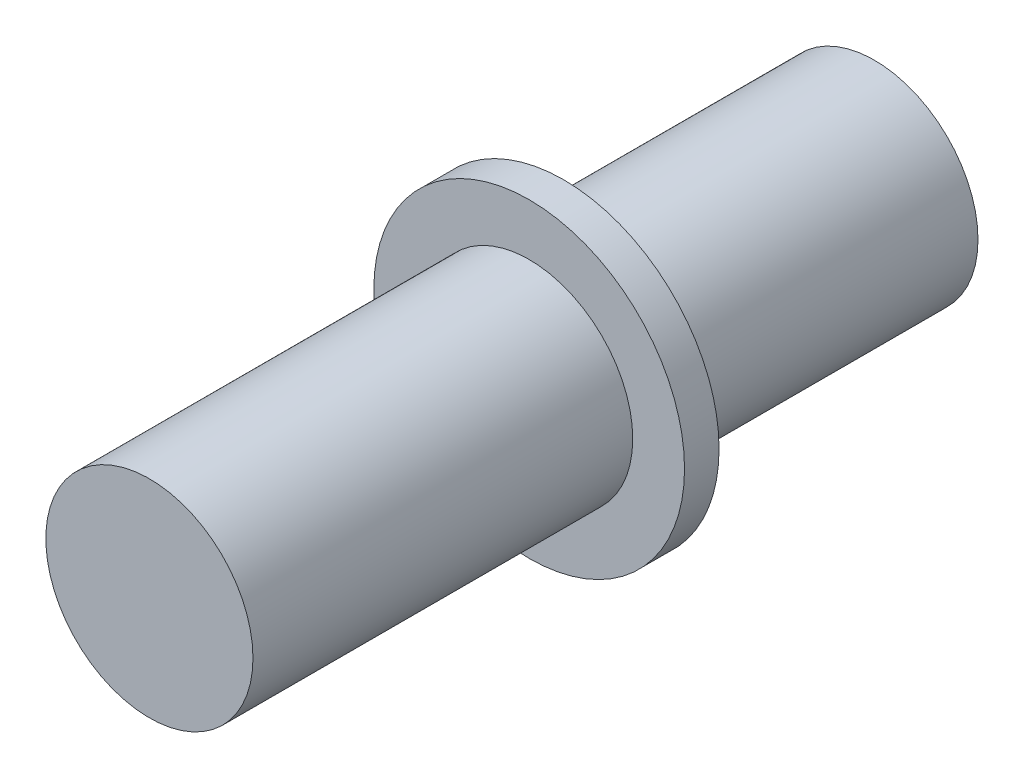
ISO-10303-21;
HEADER;
FILE_DESCRIPTION(('STEP AP214'),'2;1');
FILE_NAME('part.step','',(''),(''),'','','');
FILE_SCHEMA(('AUTOMOTIVE_DESIGN { 1 0 10303 214 1 1 1 1 }'));
ENDSEC;
DATA;
#1=APPLICATION_CONTEXT('core data for automotive mechanical design processes');
#2=APPLICATION_PROTOCOL_DEFINITION('international standard','automotive_design',2000,#1);
#3=PRODUCT_CONTEXT('',#1,'mechanical');
#4=PRODUCT('Part','Part','',(#3));
#5=PRODUCT_RELATED_PRODUCT_CATEGORY('part','',(#4));
#6=PRODUCT_DEFINITION_FORMATION('','',#4);
#7=PRODUCT_DEFINITION_CONTEXT('part definition',#1,'design');
#8=PRODUCT_DEFINITION('design','',#6,#7);
#9=PRODUCT_DEFINITION_SHAPE('','',#8);
#10=(LENGTH_UNIT() NAMED_UNIT(*) SI_UNIT(.MILLI.,.METRE.));
#11=(NAMED_UNIT(*) PLANE_ANGLE_UNIT() SI_UNIT($,.RADIAN.));
#12=(NAMED_UNIT(*) SI_UNIT($,.STERADIAN.) SOLID_ANGLE_UNIT());
#13=UNCERTAINTY_MEASURE_WITH_UNIT(LENGTH_MEASURE(1.E-05),#10,'distance_accuracy_value','');
#14=(GEOMETRIC_REPRESENTATION_CONTEXT(3) GLOBAL_UNCERTAINTY_ASSIGNED_CONTEXT((#13)) GLOBAL_UNIT_ASSIGNED_CONTEXT((#10,
#11,#12)) REPRESENTATION_CONTEXT('',''));
#15=CARTESIAN_POINT('',(0.,0.,0.));
#16=DIRECTION('',(0.,0.,1.));
#17=DIRECTION('',(1.,0.,0.));
#18=AXIS2_PLACEMENT_3D('',#15,#16,#17);
#19=CARTESIAN_POINT('',(0.,0.,42.));
#20=DIRECTION('',(0.,0.,-1.));
#21=DIRECTION('',(-1.,0.,0.));
#22=AXIS2_PLACEMENT_3D('',#19,#20,#21);
#23=CYLINDRICAL_SURFACE('',#22,6.);
#24=CARTESIAN_POINT('',(0.,0.,20.));
#25=DIRECTION('',(0.,0.,1.));
#26=DIRECTION('',(1.,0.,0.));
#27=AXIS2_PLACEMENT_3D('',#24,#25,#26);
#28=CIRCLE('',#27,6.);
#29=CARTESIAN_POINT('',(6.,0.,20.));
#30=VERTEX_POINT('',#29);
#31=EDGE_CURVE('E46',#30,#30,#28,.T.);
#32=ORIENTED_EDGE('',*,*,#31,.T.);
#33=EDGE_LOOP('',(#32));
#34=FACE_BOUND('',#33,.T.);
#35=CARTESIAN_POINT('',(0.,0.,42.));
#36=DIRECTION('',(0.,0.,1.));
#37=DIRECTION('',(1.,0.,0.));
#38=AXIS2_PLACEMENT_3D('',#35,#36,#37);
#39=CIRCLE('',#38,6.);
#40=CARTESIAN_POINT('',(6.,0.,42.));
#41=VERTEX_POINT('',#40);
#42=EDGE_CURVE('E51',#41,#41,#39,.T.);
#43=ORIENTED_EDGE('',*,*,#42,.F.);
#44=EDGE_LOOP('',(#43));
#45=FACE_BOUND('',#44,.T.);
#46=ADVANCED_FACE('F43',(#34,#45),#23,.T.);
#47=CARTESIAN_POINT('',(0.,0.,42.));
#48=DIRECTION('',(0.,0.,1.));
#49=DIRECTION('',(1.,0.,0.));
#50=AXIS2_PLACEMENT_3D('',#47,#48,#49);
#51=PLANE('',#50);
#52=ORIENTED_EDGE('',*,*,#42,.T.);
#53=EDGE_LOOP('',(#52));
#54=FACE_BOUND('',#53,.T.);
#55=ADVANCED_FACE('F88',(#54),#51,.T.);
#56=CARTESIAN_POINT('',(0.,0.,20.));
#57=DIRECTION('',(0.,0.,-1.));
#58=DIRECTION('',(-1.,0.,0.));
#59=AXIS2_PLACEMENT_3D('',#56,#57,#58);
#60=CYLINDRICAL_SURFACE('',#59,9.);
#61=CARTESIAN_POINT('',(0.,0.,20.));
#62=DIRECTION('',(0.,0.,1.));
#63=DIRECTION('',(1.,0.,0.));
#64=AXIS2_PLACEMENT_3D('',#61,#62,#63);
#65=CIRCLE('',#64,9.);
#66=CARTESIAN_POINT('',(9.,0.,20.));
#67=VERTEX_POINT('',#66);
#68=EDGE_CURVE('E66',#67,#67,#65,.T.);
#69=ORIENTED_EDGE('',*,*,#68,.F.);
#70=EDGE_LOOP('',(#69));
#71=FACE_BOUND('',#70,.T.);
#72=CARTESIAN_POINT('',(0.,0.,18.));
#73=DIRECTION('',(0.,0.,1.));
#74=DIRECTION('',(1.,0.,0.));
#75=AXIS2_PLACEMENT_3D('',#72,#73,#74);
#76=CIRCLE('',#75,9.);
#77=CARTESIAN_POINT('',(9.,0.,18.));
#78=VERTEX_POINT('',#77);
#79=EDGE_CURVE('E62',#78,#78,#76,.T.);
#80=ORIENTED_EDGE('',*,*,#79,.T.);
#81=EDGE_LOOP('',(#80));
#82=FACE_BOUND('',#81,.T.);
#83=ADVANCED_FACE('F80',(#71,#82),#60,.T.);
#84=CARTESIAN_POINT('',(0.,0.,20.));
#85=DIRECTION('',(0.,0.,1.));
#86=DIRECTION('',(1.,0.,0.));
#87=AXIS2_PLACEMENT_3D('',#84,#85,#86);
#88=PLANE('',#87);
#89=ORIENTED_EDGE('',*,*,#31,.F.);
#90=EDGE_LOOP('',(#89));
#91=FACE_BOUND('',#90,.T.);
#92=ORIENTED_EDGE('',*,*,#68,.T.);
#93=EDGE_LOOP('',(#92));
#94=FACE_BOUND('',#93,.T.);
#95=ADVANCED_FACE('F77',(#91,#94),#88,.T.);
#96=CARTESIAN_POINT('',(0.,0.,18.));
#97=DIRECTION('',(0.,0.,1.));
#98=DIRECTION('',(1.,0.,0.));
#99=AXIS2_PLACEMENT_3D('',#96,#97,#98);
#100=PLANE('',#99);
#101=CARTESIAN_POINT('',(0.,0.,18.));
#102=DIRECTION('',(0.,0.,1.));
#103=DIRECTION('',(1.,0.,0.));
#104=AXIS2_PLACEMENT_3D('',#101,#102,#103);
#105=CIRCLE('',#104,6.);
#106=CARTESIAN_POINT('',(6.,0.,18.));
#107=VERTEX_POINT('',#106);
#108=EDGE_CURVE('E10',#107,#107,#105,.T.);
#109=ORIENTED_EDGE('',*,*,#108,.T.);
#110=EDGE_LOOP('',(#109));
#111=FACE_BOUND('',#110,.T.);
#112=ORIENTED_EDGE('',*,*,#79,.F.);
#113=EDGE_LOOP('',(#112));
#114=FACE_BOUND('',#113,.T.);
#115=ADVANCED_FACE('F79',(#111,#114),#100,.F.);
#116=CARTESIAN_POINT('',(0.,0.,0.));
#117=DIRECTION('',(0.,0.,1.));
#118=DIRECTION('',(1.,0.,0.));
#119=AXIS2_PLACEMENT_3D('',#116,#117,#118);
#120=PLANE('',#119);
#121=CARTESIAN_POINT('',(0.,0.,0.));
#122=DIRECTION('',(0.,0.,1.));
#123=DIRECTION('',(1.,0.,0.));
#124=AXIS2_PLACEMENT_3D('',#121,#122,#123);
#125=CIRCLE('',#124,6.);
#126=CARTESIAN_POINT('',(6.,0.,0.));
#127=VERTEX_POINT('',#126);
#128=EDGE_CURVE('E56',#127,#127,#125,.T.);
#129=ORIENTED_EDGE('',*,*,#128,.F.);
#130=EDGE_LOOP('',(#129));
#131=FACE_BOUND('',#130,.T.);
#132=ADVANCED_FACE('F86',(#131),#120,.F.);
#133=ORIENTED_EDGE('',*,*,#128,.T.);
#134=EDGE_LOOP('',(#133));
#135=FACE_BOUND('',#134,.T.);
#136=ORIENTED_EDGE('',*,*,#108,.F.);
#137=EDGE_LOOP('',(#136));
#138=FACE_BOUND('',#137,.T.);
#139=ADVANCED_FACE('F92',(#135,#138),#23,.T.);
#140=CLOSED_SHELL('',(#46,#55,#83,#95,#115,#132,#139));
#141=MANIFOLD_SOLID_BREP('B2',#140);
#142=ADVANCED_BREP_SHAPE_REPRESENTATION('',(#18,#141),#14);
#143=SHAPE_DEFINITION_REPRESENTATION(#9,#142);
ENDSEC;
END-ISO-10303-21;
